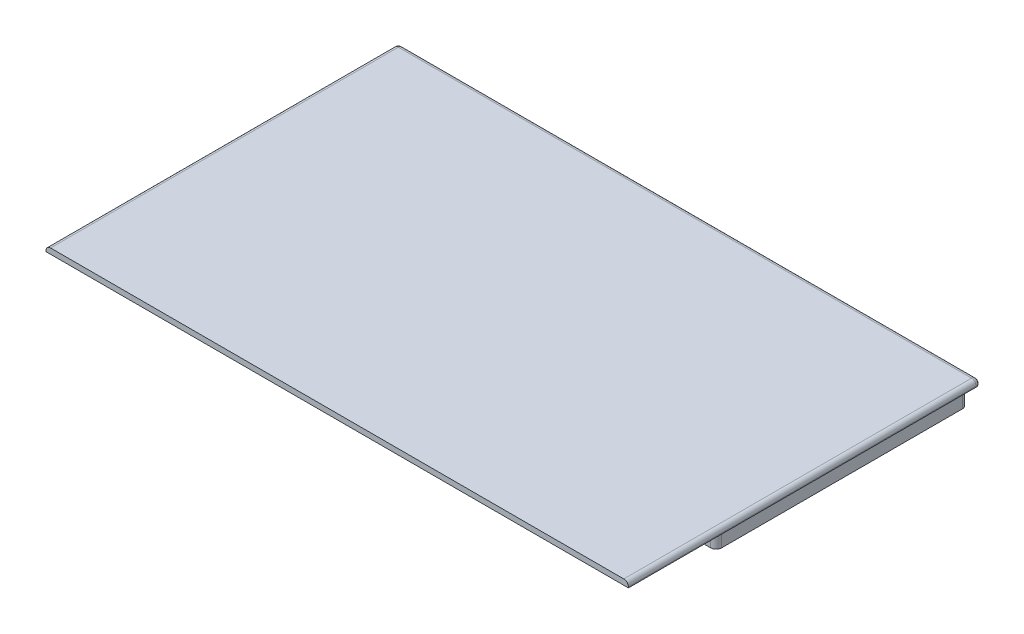
ISO-10303-21;
HEADER;
FILE_DESCRIPTION(('STEP AP214'),'2;1');
FILE_NAME('part.step','',(''),(''),'','','');
FILE_SCHEMA(('AUTOMOTIVE_DESIGN { 1 0 10303 214 1 1 1 1 }'));
ENDSEC;
DATA;
#1=APPLICATION_CONTEXT('core data for automotive mechanical design processes');
#2=APPLICATION_PROTOCOL_DEFINITION('international standard','automotive_design',2000,#1);
#3=PRODUCT_CONTEXT('',#1,'mechanical');
#4=PRODUCT('Part','Part','',(#3));
#5=PRODUCT_RELATED_PRODUCT_CATEGORY('part','',(#4));
#6=PRODUCT_DEFINITION_FORMATION('','',#4);
#7=PRODUCT_DEFINITION_CONTEXT('part definition',#1,'design');
#8=PRODUCT_DEFINITION('design','',#6,#7);
#9=PRODUCT_DEFINITION_SHAPE('','',#8);
#10=(LENGTH_UNIT() NAMED_UNIT(*) SI_UNIT(.MILLI.,.METRE.));
#11=(NAMED_UNIT(*) PLANE_ANGLE_UNIT() SI_UNIT($,.RADIAN.));
#12=(NAMED_UNIT(*) SI_UNIT($,.STERADIAN.) SOLID_ANGLE_UNIT());
#13=UNCERTAINTY_MEASURE_WITH_UNIT(LENGTH_MEASURE(1.E-05),#10,'distance_accuracy_value','');
#14=(GEOMETRIC_REPRESENTATION_CONTEXT(3) GLOBAL_UNCERTAINTY_ASSIGNED_CONTEXT((#13)) GLOBAL_UNIT_ASSIGNED_CONTEXT((#10,
#11,#12)) REPRESENTATION_CONTEXT('',''));
#15=CARTESIAN_POINT('',(0.,0.,0.));
#16=DIRECTION('',(0.,0.,1.));
#17=DIRECTION('',(1.,0.,0.));
#18=AXIS2_PLACEMENT_3D('',#15,#16,#17);
#19=CARTESIAN_POINT('',(-78.,105.,-34.75));
#20=DIRECTION('',(0.,1.,0.));
#21=DIRECTION('',(0.,0.,1.));
#22=AXIS2_PLACEMENT_3D('',#19,#20,#21);
#23=PLANE('',#22);
#24=DIRECTION('',(0.,0.,-1.));
#25=VECTOR('',#24,1.);
#26=CARTESIAN_POINT('',(79.25,105.,-36.));
#27=LINE('',#26,#25);
#28=CARTESIAN_POINT('',(79.25,105.,59.8785531963142));
#29=VERTEX_POINT('',#28);
#30=CARTESIAN_POINT('',(79.25,105.,-34.75));
#31=VERTEX_POINT('',#30);
#32=EDGE_CURVE('E54',#29,#31,#27,.T.);
#33=ORIENTED_EDGE('',*,*,#32,.F.);
#34=DIRECTION('',(1.,0.,0.));
#35=VECTOR('',#34,1.);
#36=CARTESIAN_POINT('',(-106.425872023729,105.,59.8785531963142));
#37=LINE('',#36,#35);
#38=CARTESIAN_POINT('',(-79.25,105.,59.8785531963142));
#39=VERTEX_POINT('',#38);
#40=EDGE_CURVE('E12',#39,#29,#37,.T.);
#41=ORIENTED_EDGE('',*,*,#40,.F.);
#42=DIRECTION('',(0.,0.,1.));
#43=VECTOR('',#42,1.);
#44=CARTESIAN_POINT('',(-79.25,105.,159.));
#45=LINE('',#44,#43);
#46=CARTESIAN_POINT('',(-79.25,105.,-34.75));
#47=VERTEX_POINT('',#46);
#48=EDGE_CURVE('E236',#47,#39,#45,.T.);
#49=ORIENTED_EDGE('',*,*,#48,.F.);
#50=CARTESIAN_POINT('',(-78.,105.,-34.75));
#51=DIRECTION('',(0.,-1.,0.));
#52=DIRECTION('',(0.,0.,-1.));
#53=AXIS2_PLACEMENT_3D('',#50,#51,#52);
#54=CIRCLE('',#53,1.25);
#55=CARTESIAN_POINT('',(-78.,105.,-36.));
#56=VERTEX_POINT('',#55);
#57=EDGE_CURVE('E230',#56,#47,#54,.F.);
#58=ORIENTED_EDGE('',*,*,#57,.F.);
#59=DIRECTION('',(-1.,0.,0.));
#60=VECTOR('',#59,1.);
#61=CARTESIAN_POINT('',(-79.25,105.,-36.));
#62=LINE('',#61,#60);
#63=CARTESIAN_POINT('',(78.,105.,-36.));
#64=VERTEX_POINT('',#63);
#65=EDGE_CURVE('E247',#64,#56,#62,.T.);
#66=ORIENTED_EDGE('',*,*,#65,.F.);
#67=CARTESIAN_POINT('',(78.,105.,-34.75));
#68=DIRECTION('',(0.,-1.,0.));
#69=DIRECTION('',(0.,0.,-1.));
#70=AXIS2_PLACEMENT_3D('',#67,#68,#69);
#71=CIRCLE('',#70,1.25);
#72=EDGE_CURVE('E296',#31,#64,#71,.F.);
#73=ORIENTED_EDGE('',*,*,#72,.F.);
#74=EDGE_LOOP('',(#33,#41,#49,#58,#66,#73));
#75=FACE_BOUND('',#74,.T.);
#76=DIRECTION('',(-1.,0.,0.));
#77=VECTOR('',#76,1.);
#78=CARTESIAN_POINT('',(76.,105.,-34.25));
#79=LINE('',#78,#77);
#80=CARTESIAN_POINT('',(76.,105.,-34.25));
#81=VERTEX_POINT('',#80);
#82=CARTESIAN_POINT('',(-76.,105.,-34.25));
#83=VERTEX_POINT('',#82);
#84=EDGE_CURVE('E412',#81,#83,#79,.T.);
#85=ORIENTED_EDGE('',*,*,#84,.T.);
#86=CARTESIAN_POINT('',(-76.,105.,-32.75));
#87=DIRECTION('',(0.,1.,0.));
#88=DIRECTION('',(0.,0.,1.));
#89=AXIS2_PLACEMENT_3D('',#86,#87,#88);
#90=CIRCLE('',#89,1.5);
#91=CARTESIAN_POINT('',(-77.5,105.,-32.75));
#92=VERTEX_POINT('',#91);
#93=EDGE_CURVE('E408',#83,#92,#90,.T.);
#94=ORIENTED_EDGE('',*,*,#93,.T.);
#95=DIRECTION('',(0.,0.,1.));
#96=VECTOR('',#95,1.);
#97=CARTESIAN_POINT('',(-77.5,105.,-32.75));
#98=LINE('',#97,#96);
#99=CARTESIAN_POINT('',(-77.5,105.,32.75));
#100=VERTEX_POINT('',#99);
#101=EDGE_CURVE('E411',#92,#100,#98,.T.);
#102=ORIENTED_EDGE('',*,*,#101,.T.);
#103=CARTESIAN_POINT('',(-76.,105.,32.75));
#104=DIRECTION('',(0.,1.,0.));
#105=DIRECTION('',(0.,0.,1.));
#106=AXIS2_PLACEMENT_3D('',#103,#104,#105);
#107=CIRCLE('',#106,1.5);
#108=CARTESIAN_POINT('',(-76.,105.,34.25));
#109=VERTEX_POINT('',#108);
#110=EDGE_CURVE('E415',#100,#109,#107,.T.);
#111=ORIENTED_EDGE('',*,*,#110,.T.);
#112=DIRECTION('',(1.,0.,0.));
#113=VECTOR('',#112,1.);
#114=CARTESIAN_POINT('',(-76.,105.,34.25));
#115=LINE('',#114,#113);
#116=CARTESIAN_POINT('',(76.,105.,34.25));
#117=VERTEX_POINT('',#116);
#118=EDGE_CURVE('E418',#109,#117,#115,.T.);
#119=ORIENTED_EDGE('',*,*,#118,.T.);
#120=CARTESIAN_POINT('',(76.,105.,32.75));
#121=DIRECTION('',(0.,1.,0.));
#122=DIRECTION('',(0.,0.,1.));
#123=AXIS2_PLACEMENT_3D('',#120,#121,#122);
#124=CIRCLE('',#123,1.5);
#125=CARTESIAN_POINT('',(77.5,105.,32.75));
#126=VERTEX_POINT('',#125);
#127=EDGE_CURVE('E421',#117,#126,#124,.T.);
#128=ORIENTED_EDGE('',*,*,#127,.T.);
#129=DIRECTION('',(0.,0.,-1.));
#130=VECTOR('',#129,1.);
#131=CARTESIAN_POINT('',(77.5,105.,32.75));
#132=LINE('',#131,#130);
#133=CARTESIAN_POINT('',(77.5,105.,-32.75));
#134=VERTEX_POINT('',#133);
#135=EDGE_CURVE('E424',#126,#134,#132,.T.);
#136=ORIENTED_EDGE('',*,*,#135,.T.);
#137=CARTESIAN_POINT('',(76.,105.,-32.75));
#138=DIRECTION('',(0.,1.,0.));
#139=DIRECTION('',(0.,0.,1.));
#140=AXIS2_PLACEMENT_3D('',#137,#138,#139);
#141=CIRCLE('',#140,1.5);
#142=EDGE_CURVE('E358',#134,#81,#141,.T.);
#143=ORIENTED_EDGE('',*,*,#142,.T.);
#144=EDGE_LOOP('',(#85,#94,#102,#111,#119,#128,#136,#143));
#145=FACE_BOUND('',#144,.T.);
#146=ADVANCED_FACE('F50',(#75,#145),#23,.F.);
#147=CARTESIAN_POINT('',(76.,105.,-32.75));
#148=DIRECTION('',(0.,1.,0.));
#149=DIRECTION('',(0.,0.,1.));
#150=AXIS2_PLACEMENT_3D('',#147,#148,#149);
#151=CIRCLE('',#150,0.25);
#152=CARTESIAN_POINT('',(76.25,105.,-32.75));
#153=VERTEX_POINT('',#152);
#154=CARTESIAN_POINT('',(76.,105.,-33.));
#155=VERTEX_POINT('',#154);
#156=EDGE_CURVE('E330',#153,#155,#151,.T.);
#157=ORIENTED_EDGE('',*,*,#156,.F.);
#158=DIRECTION('',(0.,0.,-1.));
#159=VECTOR('',#158,1.);
#160=CARTESIAN_POINT('',(76.25,105.,32.75));
#161=LINE('',#160,#159);
#162=CARTESIAN_POINT('',(76.25,105.,32.75));
#163=VERTEX_POINT('',#162);
#164=EDGE_CURVE('E359',#163,#153,#161,.T.);
#165=ORIENTED_EDGE('',*,*,#164,.F.);
#166=CARTESIAN_POINT('',(76.,105.,32.75));
#167=DIRECTION('',(0.,1.,0.));
#168=DIRECTION('',(0.,0.,1.));
#169=AXIS2_PLACEMENT_3D('',#166,#167,#168);
#170=CIRCLE('',#169,0.25);
#171=CARTESIAN_POINT('',(76.,105.,33.));
#172=VERTEX_POINT('',#171);
#173=EDGE_CURVE('E355',#172,#163,#170,.T.);
#174=ORIENTED_EDGE('',*,*,#173,.F.);
#175=DIRECTION('',(1.,0.,0.));
#176=VECTOR('',#175,1.);
#177=CARTESIAN_POINT('',(-76.,105.,33.));
#178=LINE('',#177,#176);
#179=CARTESIAN_POINT('',(-76.,105.,33.));
#180=VERTEX_POINT('',#179);
#181=EDGE_CURVE('E351',#180,#172,#178,.T.);
#182=ORIENTED_EDGE('',*,*,#181,.F.);
#183=CARTESIAN_POINT('',(-76.,105.,32.75));
#184=DIRECTION('',(0.,1.,0.));
#185=DIRECTION('',(0.,0.,1.));
#186=AXIS2_PLACEMENT_3D('',#183,#184,#185);
#187=CIRCLE('',#186,0.25);
#188=CARTESIAN_POINT('',(-76.25,105.,32.75));
#189=VERTEX_POINT('',#188);
#190=EDGE_CURVE('E347',#189,#180,#187,.T.);
#191=ORIENTED_EDGE('',*,*,#190,.F.);
#192=DIRECTION('',(0.,0.,1.));
#193=VECTOR('',#192,1.);
#194=CARTESIAN_POINT('',(-76.25,105.,-32.75));
#195=LINE('',#194,#193);
#196=CARTESIAN_POINT('',(-76.25,105.,-32.75));
#197=VERTEX_POINT('',#196);
#198=EDGE_CURVE('E343',#197,#189,#195,.T.);
#199=ORIENTED_EDGE('',*,*,#198,.F.);
#200=CARTESIAN_POINT('',(-76.,105.,-32.75));
#201=DIRECTION('',(0.,1.,0.));
#202=DIRECTION('',(0.,0.,1.));
#203=AXIS2_PLACEMENT_3D('',#200,#201,#202);
#204=CIRCLE('',#203,0.25);
#205=CARTESIAN_POINT('',(-76.,105.,-33.));
#206=VERTEX_POINT('',#205);
#207=EDGE_CURVE('E339',#206,#197,#204,.T.);
#208=ORIENTED_EDGE('',*,*,#207,.F.);
#209=DIRECTION('',(-1.,0.,0.));
#210=VECTOR('',#209,1.);
#211=CARTESIAN_POINT('',(76.,105.,-33.));
#212=LINE('',#211,#210);
#213=EDGE_CURVE('E335',#155,#206,#212,.T.);
#214=ORIENTED_EDGE('',*,*,#213,.F.);
#215=EDGE_LOOP('',(#157,#165,#174,#182,#191,#199,#208,#214));
#216=FACE_BOUND('',#215,.T.);
#217=ADVANCED_FACE('F52',(#216),#23,.F.);
#218=CARTESIAN_POINT('',(76.,100.,32.75));
#219=DIRECTION('',(0.,1.,0.));
#220=DIRECTION('',(0.,0.,1.));
#221=AXIS2_PLACEMENT_3D('',#218,#219,#220);
#222=CYLINDRICAL_SURFACE('',#221,0.25);
#223=ORIENTED_EDGE('',*,*,#173,.T.);
#224=DIRECTION('',(0.,1.,0.));
#225=VECTOR('',#224,1.);
#226=CARTESIAN_POINT('',(76.25,100.,32.75));
#227=LINE('',#226,#225);
#228=CARTESIAN_POINT('',(76.25,100.,32.75));
#229=VERTEX_POINT('',#228);
#230=EDGE_CURVE('E329',#229,#163,#227,.T.);
#231=ORIENTED_EDGE('',*,*,#230,.F.);
#232=CARTESIAN_POINT('',(76.,100.,32.75));
#233=DIRECTION('',(0.,1.,0.));
#234=DIRECTION('',(0.,0.,1.));
#235=AXIS2_PLACEMENT_3D('',#232,#233,#234);
#236=CIRCLE('',#235,0.25);
#237=CARTESIAN_POINT('',(76.,100.,33.));
#238=VERTEX_POINT('',#237);
#239=EDGE_CURVE('E323',#238,#229,#236,.T.);
#240=ORIENTED_EDGE('',*,*,#239,.F.);
#241=DIRECTION('',(0.,1.,0.));
#242=VECTOR('',#241,1.);
#243=CARTESIAN_POINT('',(76.,100.,33.));
#244=LINE('',#243,#242);
#245=EDGE_CURVE('E354',#238,#172,#244,.T.);
#246=ORIENTED_EDGE('',*,*,#245,.T.);
#247=EDGE_LOOP('',(#223,#231,#240,#246));
#248=FACE_BOUND('',#247,.T.);
#249=ADVANCED_FACE('F486',(#248),#222,.F.);
#250=CARTESIAN_POINT('',(-76.,100.,33.));
#251=DIRECTION('',(0.,0.,1.));
#252=DIRECTION('',(1.,0.,0.));
#253=AXIS2_PLACEMENT_3D('',#250,#251,#252);
#254=PLANE('',#253);
#255=ORIENTED_EDGE('',*,*,#181,.T.);
#256=ORIENTED_EDGE('',*,*,#245,.F.);
#257=DIRECTION('',(1.,0.,0.));
#258=VECTOR('',#257,1.);
#259=CARTESIAN_POINT('',(-76.,100.,33.));
#260=LINE('',#259,#258);
#261=CARTESIAN_POINT('',(-76.,100.,33.));
#262=VERTEX_POINT('',#261);
#263=EDGE_CURVE('E320',#262,#238,#260,.T.);
#264=ORIENTED_EDGE('',*,*,#263,.F.);
#265=DIRECTION('',(0.,1.,0.));
#266=VECTOR('',#265,1.);
#267=CARTESIAN_POINT('',(-76.,100.,33.));
#268=LINE('',#267,#266);
#269=EDGE_CURVE('E350',#262,#180,#268,.T.);
#270=ORIENTED_EDGE('',*,*,#269,.T.);
#271=EDGE_LOOP('',(#255,#256,#264,#270));
#272=FACE_BOUND('',#271,.T.);
#273=ADVANCED_FACE('F561',(#272),#254,.F.);
#274=CARTESIAN_POINT('',(-76.,100.,32.75));
#275=DIRECTION('',(0.,1.,0.));
#276=DIRECTION('',(0.,0.,1.));
#277=AXIS2_PLACEMENT_3D('',#274,#275,#276);
#278=CYLINDRICAL_SURFACE('',#277,0.25);
#279=ORIENTED_EDGE('',*,*,#190,.T.);
#280=ORIENTED_EDGE('',*,*,#269,.F.);
#281=CARTESIAN_POINT('',(-76.,100.,32.75));
#282=DIRECTION('',(0.,1.,0.));
#283=DIRECTION('',(0.,0.,1.));
#284=AXIS2_PLACEMENT_3D('',#281,#282,#283);
#285=CIRCLE('',#284,0.25);
#286=CARTESIAN_POINT('',(-76.25,100.,32.75));
#287=VERTEX_POINT('',#286);
#288=EDGE_CURVE('E317',#287,#262,#285,.T.);
#289=ORIENTED_EDGE('',*,*,#288,.F.);
#290=DIRECTION('',(0.,1.,0.));
#291=VECTOR('',#290,1.);
#292=CARTESIAN_POINT('',(-76.25,100.,32.75));
#293=LINE('',#292,#291);
#294=EDGE_CURVE('E346',#287,#189,#293,.T.);
#295=ORIENTED_EDGE('',*,*,#294,.T.);
#296=EDGE_LOOP('',(#279,#280,#289,#295));
#297=FACE_BOUND('',#296,.T.);
#298=ADVANCED_FACE('F557',(#297),#278,.F.);
#299=CARTESIAN_POINT('',(-76.25,100.,-32.75));
#300=DIRECTION('',(-1.,0.,0.));
#301=DIRECTION('',(0.,0.,1.));
#302=AXIS2_PLACEMENT_3D('',#299,#300,#301);
#303=PLANE('',#302);
#304=ORIENTED_EDGE('',*,*,#198,.T.);
#305=ORIENTED_EDGE('',*,*,#294,.F.);
#306=DIRECTION('',(0.,0.,1.));
#307=VECTOR('',#306,1.);
#308=CARTESIAN_POINT('',(-76.25,100.,-32.75));
#309=LINE('',#308,#307);
#310=CARTESIAN_POINT('',(-76.25,100.,-32.75));
#311=VERTEX_POINT('',#310);
#312=EDGE_CURVE('E314',#311,#287,#309,.T.);
#313=ORIENTED_EDGE('',*,*,#312,.F.);
#314=DIRECTION('',(0.,1.,0.));
#315=VECTOR('',#314,1.);
#316=CARTESIAN_POINT('',(-76.25,100.,-32.75));
#317=LINE('',#316,#315);
#318=EDGE_CURVE('E342',#311,#197,#317,.T.);
#319=ORIENTED_EDGE('',*,*,#318,.T.);
#320=EDGE_LOOP('',(#304,#305,#313,#319));
#321=FACE_BOUND('',#320,.T.);
#322=ADVANCED_FACE('F553',(#321),#303,.F.);
#323=CARTESIAN_POINT('',(-76.,100.,-32.75));
#324=DIRECTION('',(0.,1.,0.));
#325=DIRECTION('',(0.,0.,1.));
#326=AXIS2_PLACEMENT_3D('',#323,#324,#325);
#327=CYLINDRICAL_SURFACE('',#326,0.25);
#328=ORIENTED_EDGE('',*,*,#207,.T.);
#329=ORIENTED_EDGE('',*,*,#318,.F.);
#330=CARTESIAN_POINT('',(-76.,100.,-32.75));
#331=DIRECTION('',(0.,1.,0.));
#332=DIRECTION('',(0.,0.,1.));
#333=AXIS2_PLACEMENT_3D('',#330,#331,#332);
#334=CIRCLE('',#333,0.25);
#335=CARTESIAN_POINT('',(-76.,100.,-33.));
#336=VERTEX_POINT('',#335);
#337=EDGE_CURVE('E311',#336,#311,#334,.T.);
#338=ORIENTED_EDGE('',*,*,#337,.F.);
#339=DIRECTION('',(0.,1.,0.));
#340=VECTOR('',#339,1.);
#341=CARTESIAN_POINT('',(-76.,100.,-33.));
#342=LINE('',#341,#340);
#343=EDGE_CURVE('E338',#336,#206,#342,.T.);
#344=ORIENTED_EDGE('',*,*,#343,.T.);
#345=EDGE_LOOP('',(#328,#329,#338,#344));
#346=FACE_BOUND('',#345,.T.);
#347=ADVANCED_FACE('F549',(#346),#327,.F.);
#348=CARTESIAN_POINT('',(76.,100.,-33.));
#349=DIRECTION('',(0.,0.,-1.));
#350=DIRECTION('',(-1.,0.,0.));
#351=AXIS2_PLACEMENT_3D('',#348,#349,#350);
#352=PLANE('',#351);
#353=ORIENTED_EDGE('',*,*,#213,.T.);
#354=ORIENTED_EDGE('',*,*,#343,.F.);
#355=DIRECTION('',(-1.,0.,0.));
#356=VECTOR('',#355,1.);
#357=CARTESIAN_POINT('',(76.,100.,-33.));
#358=LINE('',#357,#356);
#359=CARTESIAN_POINT('',(76.,100.,-33.));
#360=VERTEX_POINT('',#359);
#361=EDGE_CURVE('E307',#360,#336,#358,.T.);
#362=ORIENTED_EDGE('',*,*,#361,.F.);
#363=DIRECTION('',(0.,1.,0.));
#364=VECTOR('',#363,1.);
#365=CARTESIAN_POINT('',(76.,100.,-33.));
#366=LINE('',#365,#364);
#367=EDGE_CURVE('E334',#360,#155,#366,.T.);
#368=ORIENTED_EDGE('',*,*,#367,.T.);
#369=EDGE_LOOP('',(#353,#354,#362,#368));
#370=FACE_BOUND('',#369,.T.);
#371=ADVANCED_FACE('F545',(#370),#352,.F.);
#372=CARTESIAN_POINT('',(76.,100.,-32.75));
#373=DIRECTION('',(0.,1.,0.));
#374=DIRECTION('',(0.,0.,1.));
#375=AXIS2_PLACEMENT_3D('',#372,#373,#374);
#376=CYLINDRICAL_SURFACE('',#375,0.25);
#377=ORIENTED_EDGE('',*,*,#156,.T.);
#378=ORIENTED_EDGE('',*,*,#367,.F.);
#379=CARTESIAN_POINT('',(76.,100.,-32.75));
#380=DIRECTION('',(0.,1.,0.));
#381=DIRECTION('',(0.,0.,1.));
#382=AXIS2_PLACEMENT_3D('',#379,#380,#381);
#383=CIRCLE('',#382,0.25);
#384=CARTESIAN_POINT('',(76.25,100.,-32.75));
#385=VERTEX_POINT('',#384);
#386=EDGE_CURVE('E304',#385,#360,#383,.T.);
#387=ORIENTED_EDGE('',*,*,#386,.F.);
#388=DIRECTION('',(0.,1.,0.));
#389=VECTOR('',#388,1.);
#390=CARTESIAN_POINT('',(76.25,100.,-32.75));
#391=LINE('',#390,#389);
#392=EDGE_CURVE('E333',#385,#153,#391,.T.);
#393=ORIENTED_EDGE('',*,*,#392,.T.);
#394=EDGE_LOOP('',(#377,#378,#387,#393));
#395=FACE_BOUND('',#394,.T.);
#396=ADVANCED_FACE('F539',(#395),#376,.F.);
#397=CARTESIAN_POINT('',(76.25,100.,32.75));
#398=DIRECTION('',(1.,0.,0.));
#399=DIRECTION('',(0.,0.,-1.));
#400=AXIS2_PLACEMENT_3D('',#397,#398,#399);
#401=PLANE('',#400);
#402=ORIENTED_EDGE('',*,*,#164,.T.);
#403=ORIENTED_EDGE('',*,*,#392,.F.);
#404=DIRECTION('',(0.,0.,-1.));
#405=VECTOR('',#404,1.);
#406=CARTESIAN_POINT('',(76.25,100.,32.75));
#407=LINE('',#406,#405);
#408=EDGE_CURVE('E308',#229,#385,#407,.T.);
#409=ORIENTED_EDGE('',*,*,#408,.F.);
#410=ORIENTED_EDGE('',*,*,#230,.T.);
#411=EDGE_LOOP('',(#402,#403,#409,#410));
#412=FACE_BOUND('',#411,.T.);
#413=ADVANCED_FACE('F534',(#412),#401,.F.);
#414=CARTESIAN_POINT('',(-76.,100.,-32.75));
#415=DIRECTION('',(0.,1.,0.));
#416=DIRECTION('',(0.,0.,1.));
#417=AXIS2_PLACEMENT_3D('',#414,#415,#416);
#418=PLANE('',#417);
#419=ORIENTED_EDGE('',*,*,#408,.T.);
#420=ORIENTED_EDGE('',*,*,#386,.T.);
#421=ORIENTED_EDGE('',*,*,#361,.T.);
#422=ORIENTED_EDGE('',*,*,#337,.T.);
#423=ORIENTED_EDGE('',*,*,#312,.T.);
#424=ORIENTED_EDGE('',*,*,#288,.T.);
#425=ORIENTED_EDGE('',*,*,#263,.T.);
#426=ORIENTED_EDGE('',*,*,#239,.T.);
#427=EDGE_LOOP('',(#419,#420,#421,#422,#423,#424,#425,#426));
#428=FACE_BOUND('',#427,.T.);
#429=CARTESIAN_POINT('',(-76.,100.,-32.75));
#430=DIRECTION('',(0.,1.,0.));
#431=DIRECTION('',(0.,0.,1.));
#432=AXIS2_PLACEMENT_3D('',#429,#430,#431);
#433=CIRCLE('',#432,1.5);
#434=CARTESIAN_POINT('',(-76.,100.,-34.25));
#435=VERTEX_POINT('',#434);
#436=CARTESIAN_POINT('',(-77.5,100.,-32.75));
#437=VERTEX_POINT('',#436);
#438=EDGE_CURVE('E378',#435,#437,#433,.T.);
#439=ORIENTED_EDGE('',*,*,#438,.F.);
#440=DIRECTION('',(-1.,0.,0.));
#441=VECTOR('',#440,1.);
#442=CARTESIAN_POINT('',(76.,100.,-34.25));
#443=LINE('',#442,#441);
#444=CARTESIAN_POINT('',(76.,100.,-34.25));
#445=VERTEX_POINT('',#444);
#446=EDGE_CURVE('E404',#445,#435,#443,.T.);
#447=ORIENTED_EDGE('',*,*,#446,.F.);
#448=CARTESIAN_POINT('',(76.,100.,-32.75));
#449=DIRECTION('',(0.,1.,0.));
#450=DIRECTION('',(0.,0.,1.));
#451=AXIS2_PLACEMENT_3D('',#448,#449,#450);
#452=CIRCLE('',#451,1.5);
#453=CARTESIAN_POINT('',(77.5,100.,-32.75));
#454=VERTEX_POINT('',#453);
#455=EDGE_CURVE('E326',#454,#445,#452,.T.);
#456=ORIENTED_EDGE('',*,*,#455,.F.);
#457=DIRECTION('',(0.,0.,-1.));
#458=VECTOR('',#457,1.);
#459=CARTESIAN_POINT('',(77.5,100.,32.75));
#460=LINE('',#459,#458);
#461=CARTESIAN_POINT('',(77.5,100.,32.75));
#462=VERTEX_POINT('',#461);
#463=EDGE_CURVE('E398',#462,#454,#460,.T.);
#464=ORIENTED_EDGE('',*,*,#463,.F.);
#465=CARTESIAN_POINT('',(76.,100.,32.75));
#466=DIRECTION('',(0.,1.,0.));
#467=DIRECTION('',(0.,0.,1.));
#468=AXIS2_PLACEMENT_3D('',#465,#466,#467);
#469=CIRCLE('',#468,1.5);
#470=CARTESIAN_POINT('',(76.,100.,34.25));
#471=VERTEX_POINT('',#470);
#472=EDGE_CURVE('E394',#471,#462,#469,.T.);
#473=ORIENTED_EDGE('',*,*,#472,.F.);
#474=DIRECTION('',(1.,0.,0.));
#475=VECTOR('',#474,1.);
#476=CARTESIAN_POINT('',(-76.,100.,34.25));
#477=LINE('',#476,#475);
#478=CARTESIAN_POINT('',(-76.,100.,34.25));
#479=VERTEX_POINT('',#478);
#480=EDGE_CURVE('E390',#479,#471,#477,.T.);
#481=ORIENTED_EDGE('',*,*,#480,.F.);
#482=CARTESIAN_POINT('',(-76.,100.,32.75));
#483=DIRECTION('',(0.,1.,0.));
#484=DIRECTION('',(0.,0.,1.));
#485=AXIS2_PLACEMENT_3D('',#482,#483,#484);
#486=CIRCLE('',#485,1.5);
#487=CARTESIAN_POINT('',(-77.5,100.,32.75));
#488=VERTEX_POINT('',#487);
#489=EDGE_CURVE('E386',#488,#479,#486,.T.);
#490=ORIENTED_EDGE('',*,*,#489,.F.);
#491=DIRECTION('',(0.,0.,1.));
#492=VECTOR('',#491,1.);
#493=CARTESIAN_POINT('',(-77.5,100.,-32.75));
#494=LINE('',#493,#492);
#495=EDGE_CURVE('E382',#437,#488,#494,.T.);
#496=ORIENTED_EDGE('',*,*,#495,.F.);
#497=EDGE_LOOP('',(#439,#447,#456,#464,#473,#481,#490,#496));
#498=FACE_BOUND('',#497,.T.);
#499=ADVANCED_FACE('F450',(#428,#498),#418,.F.);
#500=CARTESIAN_POINT('',(76.,100.,-32.75));
#501=DIRECTION('',(0.,1.,0.));
#502=DIRECTION('',(0.,0.,1.));
#503=AXIS2_PLACEMENT_3D('',#500,#501,#502);
#504=CYLINDRICAL_SURFACE('',#503,1.5);
#505=ORIENTED_EDGE('',*,*,#142,.F.);
#506=DIRECTION('',(0.,1.,0.));
#507=VECTOR('',#506,1.);
#508=CARTESIAN_POINT('',(77.5,100.,-32.75));
#509=LINE('',#508,#507);
#510=EDGE_CURVE('E397',#454,#134,#509,.T.);
#511=ORIENTED_EDGE('',*,*,#510,.F.);
#512=ORIENTED_EDGE('',*,*,#455,.T.);
#513=DIRECTION('',(0.,1.,0.));
#514=VECTOR('',#513,1.);
#515=CARTESIAN_POINT('',(76.,100.,-34.25));
#516=LINE('',#515,#514);
#517=EDGE_CURVE('E401',#445,#81,#516,.T.);
#518=ORIENTED_EDGE('',*,*,#517,.T.);
#519=EDGE_LOOP('',(#505,#511,#512,#518));
#520=FACE_BOUND('',#519,.T.);
#521=ADVANCED_FACE('F468',(#520),#504,.T.);
#522=CARTESIAN_POINT('',(77.5,100.,32.75));
#523=DIRECTION('',(1.,0.,0.));
#524=DIRECTION('',(0.,0.,-1.));
#525=AXIS2_PLACEMENT_3D('',#522,#523,#524);
#526=PLANE('',#525);
#527=ORIENTED_EDGE('',*,*,#135,.F.);
#528=DIRECTION('',(0.,1.,0.));
#529=VECTOR('',#528,1.);
#530=CARTESIAN_POINT('',(77.5,100.,32.75));
#531=LINE('',#530,#529);
#532=EDGE_CURVE('E393',#462,#126,#531,.T.);
#533=ORIENTED_EDGE('',*,*,#532,.F.);
#534=ORIENTED_EDGE('',*,*,#463,.T.);
#535=ORIENTED_EDGE('',*,*,#510,.T.);
#536=EDGE_LOOP('',(#527,#533,#534,#535));
#537=FACE_BOUND('',#536,.T.);
#538=ADVANCED_FACE('F464',(#537),#526,.T.);
#539=CARTESIAN_POINT('',(76.,100.,32.75));
#540=DIRECTION('',(0.,1.,0.));
#541=DIRECTION('',(0.,0.,1.));
#542=AXIS2_PLACEMENT_3D('',#539,#540,#541);
#543=CYLINDRICAL_SURFACE('',#542,1.5);
#544=ORIENTED_EDGE('',*,*,#127,.F.);
#545=DIRECTION('',(0.,1.,0.));
#546=VECTOR('',#545,1.);
#547=CARTESIAN_POINT('',(76.,100.,34.25));
#548=LINE('',#547,#546);
#549=EDGE_CURVE('E389',#471,#117,#548,.T.);
#550=ORIENTED_EDGE('',*,*,#549,.F.);
#551=ORIENTED_EDGE('',*,*,#472,.T.);
#552=ORIENTED_EDGE('',*,*,#532,.T.);
#553=EDGE_LOOP('',(#544,#550,#551,#552));
#554=FACE_BOUND('',#553,.T.);
#555=ADVANCED_FACE('F461',(#554),#543,.T.);
#556=CARTESIAN_POINT('',(-76.,100.,34.25));
#557=DIRECTION('',(0.,0.,1.));
#558=DIRECTION('',(1.,0.,0.));
#559=AXIS2_PLACEMENT_3D('',#556,#557,#558);
#560=PLANE('',#559);
#561=ORIENTED_EDGE('',*,*,#118,.F.);
#562=DIRECTION('',(0.,1.,0.));
#563=VECTOR('',#562,1.);
#564=CARTESIAN_POINT('',(-76.,100.,34.25));
#565=LINE('',#564,#563);
#566=EDGE_CURVE('E385',#479,#109,#565,.T.);
#567=ORIENTED_EDGE('',*,*,#566,.F.);
#568=ORIENTED_EDGE('',*,*,#480,.T.);
#569=ORIENTED_EDGE('',*,*,#549,.T.);
#570=EDGE_LOOP('',(#561,#567,#568,#569));
#571=FACE_BOUND('',#570,.T.);
#572=ADVANCED_FACE('F457',(#571),#560,.T.);
#573=CARTESIAN_POINT('',(-76.,100.,32.75));
#574=DIRECTION('',(0.,1.,0.));
#575=DIRECTION('',(0.,0.,1.));
#576=AXIS2_PLACEMENT_3D('',#573,#574,#575);
#577=CYLINDRICAL_SURFACE('',#576,1.5);
#578=ORIENTED_EDGE('',*,*,#110,.F.);
#579=DIRECTION('',(0.,1.,0.));
#580=VECTOR('',#579,1.);
#581=CARTESIAN_POINT('',(-77.5,100.,32.75));
#582=LINE('',#581,#580);
#583=EDGE_CURVE('E381',#488,#100,#582,.T.);
#584=ORIENTED_EDGE('',*,*,#583,.F.);
#585=ORIENTED_EDGE('',*,*,#489,.T.);
#586=ORIENTED_EDGE('',*,*,#566,.T.);
#587=EDGE_LOOP('',(#578,#584,#585,#586));
#588=FACE_BOUND('',#587,.T.);
#589=ADVANCED_FACE('F454',(#588),#577,.T.);
#590=CARTESIAN_POINT('',(-77.5,100.,-32.75));
#591=DIRECTION('',(-1.,0.,0.));
#592=DIRECTION('',(0.,0.,1.));
#593=AXIS2_PLACEMENT_3D('',#590,#591,#592);
#594=PLANE('',#593);
#595=ORIENTED_EDGE('',*,*,#101,.F.);
#596=DIRECTION('',(0.,1.,0.));
#597=VECTOR('',#596,1.);
#598=CARTESIAN_POINT('',(-77.5,100.,-32.75));
#599=LINE('',#598,#597);
#600=EDGE_CURVE('E251',#437,#92,#599,.T.);
#601=ORIENTED_EDGE('',*,*,#600,.F.);
#602=ORIENTED_EDGE('',*,*,#495,.T.);
#603=ORIENTED_EDGE('',*,*,#583,.T.);
#604=EDGE_LOOP('',(#595,#601,#602,#603));
#605=FACE_BOUND('',#604,.T.);
#606=ADVANCED_FACE('F439',(#605),#594,.T.);
#607=CARTESIAN_POINT('',(-76.,100.,-32.75));
#608=DIRECTION('',(0.,1.,0.));
#609=DIRECTION('',(0.,0.,1.));
#610=AXIS2_PLACEMENT_3D('',#607,#608,#609);
#611=CYLINDRICAL_SURFACE('',#610,1.5);
#612=ORIENTED_EDGE('',*,*,#93,.F.);
#613=DIRECTION('',(0.,1.,0.));
#614=VECTOR('',#613,1.);
#615=CARTESIAN_POINT('',(-76.,100.,-34.25));
#616=LINE('',#615,#614);
#617=EDGE_CURVE('E407',#435,#83,#616,.T.);
#618=ORIENTED_EDGE('',*,*,#617,.F.);
#619=ORIENTED_EDGE('',*,*,#438,.T.);
#620=ORIENTED_EDGE('',*,*,#600,.T.);
#621=EDGE_LOOP('',(#612,#618,#619,#620));
#622=FACE_BOUND('',#621,.T.);
#623=ADVANCED_FACE('F447',(#622),#611,.T.);
#624=CARTESIAN_POINT('',(76.,100.,-34.25));
#625=DIRECTION('',(0.,0.,-1.));
#626=DIRECTION('',(-1.,0.,0.));
#627=AXIS2_PLACEMENT_3D('',#624,#625,#626);
#628=PLANE('',#627);
#629=ORIENTED_EDGE('',*,*,#84,.F.);
#630=ORIENTED_EDGE('',*,*,#517,.F.);
#631=ORIENTED_EDGE('',*,*,#446,.T.);
#632=ORIENTED_EDGE('',*,*,#617,.T.);
#633=EDGE_LOOP('',(#629,#630,#631,#632));
#634=FACE_BOUND('',#633,.T.);
#635=ADVANCED_FACE('F470',(#634),#628,.T.);
#636=CARTESIAN_POINT('',(-78.,106.5,-34.75));
#637=DIRECTION('',(0.,1.,0.));
#638=DIRECTION('',(0.,0.,1.));
#639=AXIS2_PLACEMENT_3D('',#636,#637,#638);
#640=PLANE('',#639);
#641=DIRECTION('',(-1.,0.,0.));
#642=VECTOR('',#641,1.);
#643=CARTESIAN_POINT('',(-78.,106.5,59.8785531963142));
#644=LINE('',#643,#642);
#645=CARTESIAN_POINT('',(78.,106.5,59.8785531963142));
#646=VERTEX_POINT('',#645);
#647=CARTESIAN_POINT('',(-78.,106.5,59.8785531963142));
#648=VERTEX_POINT('',#647);
#649=EDGE_CURVE('E205',#646,#648,#644,.T.);
#650=ORIENTED_EDGE('',*,*,#649,.F.);
#651=DIRECTION('',(0.,0.,-1.));
#652=VECTOR('',#651,1.);
#653=CARTESIAN_POINT('',(78.,106.5,-34.75));
#654=LINE('',#653,#652);
#655=CARTESIAN_POINT('',(78.,106.5,-34.75));
#656=VERTEX_POINT('',#655);
#657=EDGE_CURVE('E232',#646,#656,#654,.T.);
#658=ORIENTED_EDGE('',*,*,#657,.T.);
#659=DIRECTION('',(-1.,0.,0.));
#660=VECTOR('',#659,1.);
#661=CARTESIAN_POINT('',(-78.,106.5,-34.75));
#662=LINE('',#661,#660);
#663=CARTESIAN_POINT('',(-78.,106.5,-34.75));
#664=VERTEX_POINT('',#663);
#665=EDGE_CURVE('E227',#656,#664,#662,.T.);
#666=ORIENTED_EDGE('',*,*,#665,.T.);
#667=DIRECTION('',(0.,0.,1.));
#668=VECTOR('',#667,1.);
#669=CARTESIAN_POINT('',(-78.,106.5,-34.75));
#670=LINE('',#669,#668);
#671=EDGE_CURVE('E221',#664,#648,#670,.T.);
#672=ORIENTED_EDGE('',*,*,#671,.T.);
#673=EDGE_LOOP('',(#650,#658,#666,#672));
#674=FACE_BOUND('',#673,.T.);
#675=ADVANCED_FACE('F225',(#674),#640,.T.);
#676=CARTESIAN_POINT('',(-78.,-1.25,-34.75));
#677=DIRECTION('',(0.,1.,0.));
#678=DIRECTION('',(0.,0.,1.));
#679=AXIS2_PLACEMENT_3D('',#676,#677,#678);
#680=CYLINDRICAL_SURFACE('',#679,1.25);
#681=DIRECTION('',(0.,1.,0.));
#682=VECTOR('',#681,1.);
#683=CARTESIAN_POINT('',(-79.25,-1.25,-34.75));
#684=LINE('',#683,#682);
#685=CARTESIAN_POINT('',(-79.25,105.25,-34.75));
#686=VERTEX_POINT('',#685);
#687=EDGE_CURVE('E239',#686,#47,#684,.F.);
#688=ORIENTED_EDGE('',*,*,#687,.F.);
#689=CARTESIAN_POINT('',(-78.,105.25,-34.75));
#690=DIRECTION('',(0.,1.,0.));
#691=DIRECTION('',(0.,0.,1.));
#692=AXIS2_PLACEMENT_3D('',#689,#690,#691);
#693=CIRCLE('',#692,1.25);
#694=CARTESIAN_POINT('',(-78.,105.25,-36.));
#695=VERTEX_POINT('',#694);
#696=EDGE_CURVE('E228',#686,#695,#693,.F.);
#697=ORIENTED_EDGE('',*,*,#696,.T.);
#698=DIRECTION('',(0.,1.,0.));
#699=VECTOR('',#698,1.);
#700=CARTESIAN_POINT('',(-78.,-1.25,-36.));
#701=LINE('',#700,#699);
#702=EDGE_CURVE('E257',#56,#695,#701,.T.);
#703=ORIENTED_EDGE('',*,*,#702,.F.);
#704=ORIENTED_EDGE('',*,*,#57,.T.);
#705=EDGE_LOOP('',(#688,#697,#703,#704));
#706=FACE_BOUND('',#705,.T.);
#707=ADVANCED_FACE('F477',(#706),#680,.T.);
#708=CARTESIAN_POINT('',(78.,-1.25,-34.75));
#709=DIRECTION('',(0.,1.,0.));
#710=DIRECTION('',(0.,0.,1.));
#711=AXIS2_PLACEMENT_3D('',#708,#709,#710);
#712=CYLINDRICAL_SURFACE('',#711,1.25);
#713=DIRECTION('',(0.,1.,0.));
#714=VECTOR('',#713,1.);
#715=CARTESIAN_POINT('',(78.,-1.25,-36.));
#716=LINE('',#715,#714);
#717=CARTESIAN_POINT('',(78.,105.25,-36.));
#718=VERTEX_POINT('',#717);
#719=EDGE_CURVE('E261',#718,#64,#716,.F.);
#720=ORIENTED_EDGE('',*,*,#719,.F.);
#721=CARTESIAN_POINT('',(78.,105.25,-34.75));
#722=DIRECTION('',(0.,1.,0.));
#723=DIRECTION('',(0.,0.,1.));
#724=AXIS2_PLACEMENT_3D('',#721,#722,#723);
#725=CIRCLE('',#724,1.25);
#726=CARTESIAN_POINT('',(79.25,105.25,-34.75));
#727=VERTEX_POINT('',#726);
#728=EDGE_CURVE('E280',#718,#727,#725,.F.);
#729=ORIENTED_EDGE('',*,*,#728,.T.);
#730=DIRECTION('',(0.,1.,0.));
#731=VECTOR('',#730,1.);
#732=CARTESIAN_POINT('',(79.25,-1.25,-34.75));
#733=LINE('',#732,#731);
#734=EDGE_CURVE('E253',#31,#727,#733,.T.);
#735=ORIENTED_EDGE('',*,*,#734,.F.);
#736=ORIENTED_EDGE('',*,*,#72,.T.);
#737=EDGE_LOOP('',(#720,#729,#735,#736));
#738=FACE_BOUND('',#737,.T.);
#739=ADVANCED_FACE('F492',(#738),#712,.T.);
#740=CARTESIAN_POINT('',(79.25,-1.25,-36.));
#741=DIRECTION('',(1.,0.,0.));
#742=DIRECTION('',(0.,0.,-1.));
#743=AXIS2_PLACEMENT_3D('',#740,#741,#742);
#744=PLANE('',#743);
#745=DIRECTION('',(0.,1.,0.));
#746=VECTOR('',#745,1.);
#747=CARTESIAN_POINT('',(79.25,-1.25,59.8785531963141));
#748=LINE('',#747,#746);
#749=CARTESIAN_POINT('',(79.25,105.25,59.8785531963142));
#750=VERTEX_POINT('',#749);
#751=EDGE_CURVE('E263',#29,#750,#748,.T.);
#752=ORIENTED_EDGE('',*,*,#751,.F.);
#753=ORIENTED_EDGE('',*,*,#32,.T.);
#754=ORIENTED_EDGE('',*,*,#734,.T.);
#755=DIRECTION('',(0.,0.,-1.));
#756=VECTOR('',#755,1.);
#757=CARTESIAN_POINT('',(79.25,105.25,-36.));
#758=LINE('',#757,#756);
#759=EDGE_CURVE('E256',#727,#750,#758,.F.);
#760=ORIENTED_EDGE('',*,*,#759,.T.);
#761=EDGE_LOOP('',(#752,#753,#754,#760));
#762=FACE_BOUND('',#761,.T.);
#763=ADVANCED_FACE('F270',(#762),#744,.T.);
#764=CARTESIAN_POINT('',(-79.25,-1.25,-36.));
#765=DIRECTION('',(0.,0.,-1.));
#766=DIRECTION('',(-1.,0.,0.));
#767=AXIS2_PLACEMENT_3D('',#764,#765,#766);
#768=PLANE('',#767);
#769=ORIENTED_EDGE('',*,*,#702,.T.);
#770=DIRECTION('',(-1.,0.,0.));
#771=VECTOR('',#770,1.);
#772=CARTESIAN_POINT('',(-79.25,105.25,-36.));
#773=LINE('',#772,#771);
#774=EDGE_CURVE('E260',#695,#718,#773,.F.);
#775=ORIENTED_EDGE('',*,*,#774,.T.);
#776=ORIENTED_EDGE('',*,*,#719,.T.);
#777=ORIENTED_EDGE('',*,*,#65,.T.);
#778=EDGE_LOOP('',(#769,#775,#776,#777));
#779=FACE_BOUND('',#778,.T.);
#780=ADVANCED_FACE('F494',(#779),#768,.T.);
#781=CARTESIAN_POINT('',(-79.25,-1.25,159.));
#782=DIRECTION('',(-1.,0.,0.));
#783=DIRECTION('',(0.,0.,1.));
#784=AXIS2_PLACEMENT_3D('',#781,#782,#783);
#785=PLANE('',#784);
#786=DIRECTION('',(0.,-1.,0.));
#787=VECTOR('',#786,1.);
#788=CARTESIAN_POINT('',(-79.25,-1.25,59.8785531963142));
#789=LINE('',#788,#787);
#790=CARTESIAN_POINT('',(-79.25,105.25,59.8785531963142));
#791=VERTEX_POINT('',#790);
#792=EDGE_CURVE('E60',#791,#39,#789,.T.);
#793=ORIENTED_EDGE('',*,*,#792,.F.);
#794=DIRECTION('',(0.,0.,1.));
#795=VECTOR('',#794,1.);
#796=CARTESIAN_POINT('',(-79.25,105.25,159.));
#797=LINE('',#796,#795);
#798=EDGE_CURVE('E223',#791,#686,#797,.F.);
#799=ORIENTED_EDGE('',*,*,#798,.T.);
#800=ORIENTED_EDGE('',*,*,#687,.T.);
#801=ORIENTED_EDGE('',*,*,#48,.T.);
#802=EDGE_LOOP('',(#793,#799,#800,#801));
#803=FACE_BOUND('',#802,.T.);
#804=ADVANCED_FACE('F509',(#803),#785,.T.);
#805=CARTESIAN_POINT('',(78.,105.25,-34.75));
#806=DIRECTION('',(0.,0.,-1.));
#807=DIRECTION('',(-1.,0.,0.));
#808=AXIS2_PLACEMENT_3D('',#805,#806,#807);
#809=CYLINDRICAL_SURFACE('',#808,1.25);
#810=CARTESIAN_POINT('',(78.,105.25,59.8785531963142));
#811=DIRECTION('',(0.,0.,-1.));
#812=DIRECTION('',(-1.,0.,0.));
#813=AXIS2_PLACEMENT_3D('',#810,#811,#812);
#814=CIRCLE('',#813,1.25);
#815=EDGE_CURVE('E211',#750,#646,#814,.F.);
#816=ORIENTED_EDGE('',*,*,#815,.F.);
#817=ORIENTED_EDGE('',*,*,#759,.F.);
#818=CARTESIAN_POINT('',(78.,105.25,-34.75));
#819=DIRECTION('',(0.,0.,-1.));
#820=DIRECTION('',(-1.,0.,0.));
#821=AXIS2_PLACEMENT_3D('',#818,#819,#820);
#822=CIRCLE('',#821,1.25);
#823=EDGE_CURVE('E238',#656,#727,#822,.T.);
#824=ORIENTED_EDGE('',*,*,#823,.F.);
#825=ORIENTED_EDGE('',*,*,#657,.F.);
#826=EDGE_LOOP('',(#816,#817,#824,#825));
#827=FACE_BOUND('',#826,.T.);
#828=ADVANCED_FACE('F275',(#827),#809,.T.);
#829=CARTESIAN_POINT('',(-78.,105.25,-34.75));
#830=DIRECTION('',(0.,0.,1.));
#831=DIRECTION('',(1.,0.,0.));
#832=AXIS2_PLACEMENT_3D('',#829,#830,#831);
#833=CYLINDRICAL_SURFACE('',#832,1.25);
#834=CARTESIAN_POINT('',(-78.,105.25,59.8785531963142));
#835=DIRECTION('',(0.,0.,-1.));
#836=DIRECTION('',(-1.,0.,0.));
#837=AXIS2_PLACEMENT_3D('',#834,#835,#836);
#838=CIRCLE('',#837,1.25);
#839=EDGE_CURVE('E208',#648,#791,#838,.F.);
#840=ORIENTED_EDGE('',*,*,#839,.F.);
#841=ORIENTED_EDGE('',*,*,#671,.F.);
#842=CARTESIAN_POINT('',(-78.,105.25,-34.75));
#843=DIRECTION('',(0.,0.,-1.));
#844=DIRECTION('',(-1.,0.,0.));
#845=AXIS2_PLACEMENT_3D('',#842,#843,#844);
#846=CIRCLE('',#845,1.25);
#847=EDGE_CURVE('E243',#686,#664,#846,.T.);
#848=ORIENTED_EDGE('',*,*,#847,.F.);
#849=ORIENTED_EDGE('',*,*,#798,.F.);
#850=EDGE_LOOP('',(#840,#841,#848,#849));
#851=FACE_BOUND('',#850,.T.);
#852=ADVANCED_FACE('F219',(#851),#833,.T.);
#853=CARTESIAN_POINT('',(78.,105.25,-34.75));
#854=DIRECTION('',(0.,1.,0.));
#855=DIRECTION('',(0.,0.,1.));
#856=AXIS2_PLACEMENT_3D('',#853,#854,#855);
#857=SPHERICAL_SURFACE('',#856,1.25);
#858=ORIENTED_EDGE('',*,*,#823,.T.);
#859=ORIENTED_EDGE('',*,*,#728,.F.);
#860=CARTESIAN_POINT('',(78.,105.25,-34.75));
#861=DIRECTION('',(-1.,0.,0.));
#862=DIRECTION('',(0.,0.,1.));
#863=AXIS2_PLACEMENT_3D('',#860,#861,#862);
#864=CIRCLE('',#863,1.25);
#865=EDGE_CURVE('E282',#656,#718,#864,.T.);
#866=ORIENTED_EDGE('',*,*,#865,.F.);
#867=EDGE_LOOP('',(#858,#859,#866));
#868=FACE_BOUND('',#867,.T.);
#869=ADVANCED_FACE('F279',(#868),#857,.T.);
#870=CARTESIAN_POINT('',(-78.,105.25,-34.75));
#871=DIRECTION('',(0.,1.,0.));
#872=DIRECTION('',(0.,0.,1.));
#873=AXIS2_PLACEMENT_3D('',#870,#871,#872);
#874=SPHERICAL_SURFACE('',#873,1.25);
#875=ORIENTED_EDGE('',*,*,#696,.F.);
#876=ORIENTED_EDGE('',*,*,#847,.T.);
#877=CARTESIAN_POINT('',(-78.,105.25,-34.75));
#878=DIRECTION('',(1.,0.,0.));
#879=DIRECTION('',(0.,0.,-1.));
#880=AXIS2_PLACEMENT_3D('',#877,#878,#879);
#881=CIRCLE('',#880,1.25);
#882=EDGE_CURVE('E265',#695,#664,#881,.T.);
#883=ORIENTED_EDGE('',*,*,#882,.F.);
#884=EDGE_LOOP('',(#875,#876,#883));
#885=FACE_BOUND('',#884,.T.);
#886=ADVANCED_FACE('F292',(#885),#874,.T.);
#887=CARTESIAN_POINT('',(-78.,105.25,-34.75));
#888=DIRECTION('',(-1.,0.,0.));
#889=DIRECTION('',(0.,0.,1.));
#890=AXIS2_PLACEMENT_3D('',#887,#888,#889);
#891=CYLINDRICAL_SURFACE('',#890,1.25);
#892=ORIENTED_EDGE('',*,*,#865,.T.);
#893=ORIENTED_EDGE('',*,*,#774,.F.);
#894=ORIENTED_EDGE('',*,*,#882,.T.);
#895=ORIENTED_EDGE('',*,*,#665,.F.);
#896=EDGE_LOOP('',(#892,#893,#894,#895));
#897=FACE_BOUND('',#896,.T.);
#898=ADVANCED_FACE('F286',(#897),#891,.T.);
#899=CARTESIAN_POINT('',(-106.425872023729,213.,59.8785531963142));
#900=DIRECTION('',(0.,0.,-1.));
#901=DIRECTION('',(-1.,0.,0.));
#902=AXIS2_PLACEMENT_3D('',#899,#900,#901);
#903=PLANE('',#902);
#904=ORIENTED_EDGE('',*,*,#751,.T.);
#905=ORIENTED_EDGE('',*,*,#815,.T.);
#906=ORIENTED_EDGE('',*,*,#649,.T.);
#907=ORIENTED_EDGE('',*,*,#839,.T.);
#908=ORIENTED_EDGE('',*,*,#792,.T.);
#909=ORIENTED_EDGE('',*,*,#40,.T.);
#910=EDGE_LOOP('',(#904,#905,#906,#907,#908,#909));
#911=FACE_BOUND('',#910,.T.);
#912=ADVANCED_FACE('F207',(#911),#903,.F.);
#913=CLOSED_SHELL('',(#146,#217,#249,#273,#298,#322,#347,#371,#396,#413,#499,#521,#538,#555,
#572,#589,#606,#623,#635,#675,#707,#739,#763,#780,#804,#828,#852,#869,#886,#898,#912));
#914=MANIFOLD_SOLID_BREP('B2',#913);
#915=ADVANCED_BREP_SHAPE_REPRESENTATION('',(#18,#914),#14);
#916=SHAPE_DEFINITION_REPRESENTATION(#9,#915);
ENDSEC;
END-ISO-10303-21;
